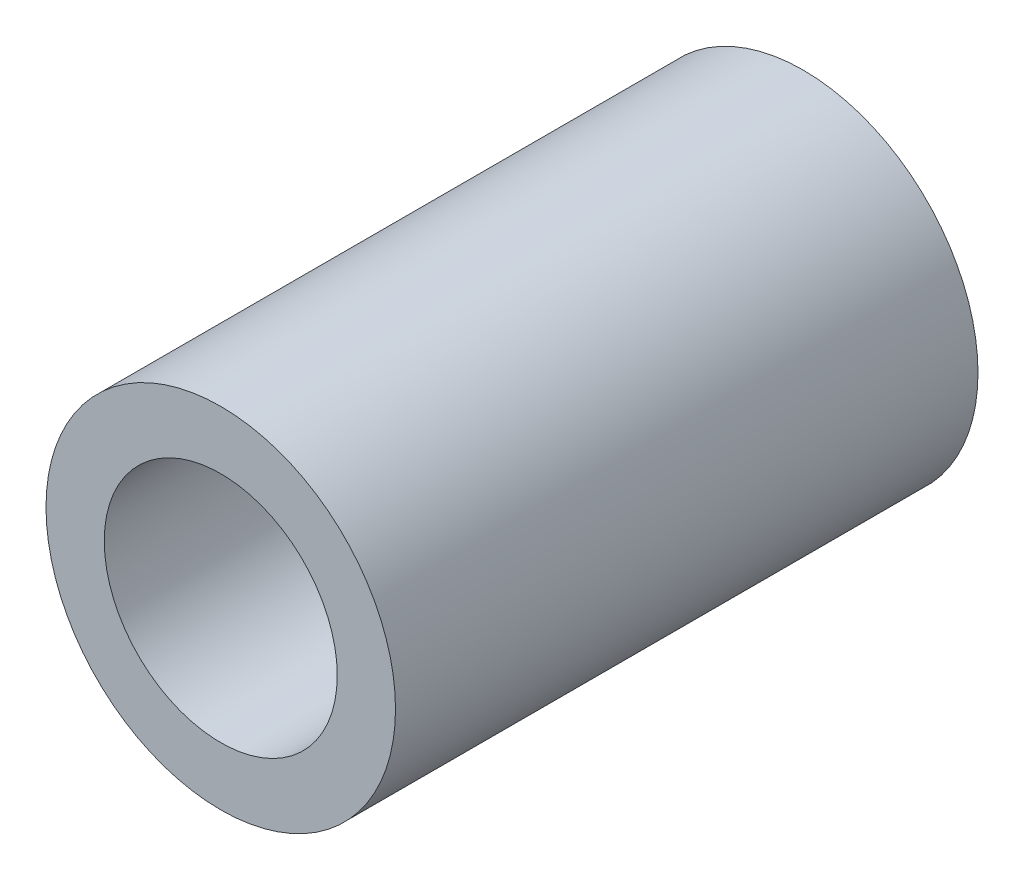
ISO-10303-21;
HEADER;
FILE_DESCRIPTION(('STEP AP214'),'2;1');
FILE_NAME('part.step','',(''),(''),'','','');
FILE_SCHEMA(('AUTOMOTIVE_DESIGN { 1 0 10303 214 1 1 1 1 }'));
ENDSEC;
DATA;
#1=APPLICATION_CONTEXT('core data for automotive mechanical design processes');
#2=APPLICATION_PROTOCOL_DEFINITION('international standard','automotive_design',2000,#1);
#3=PRODUCT_CONTEXT('',#1,'mechanical');
#4=PRODUCT('Part','Part','',(#3));
#5=PRODUCT_RELATED_PRODUCT_CATEGORY('part','',(#4));
#6=PRODUCT_DEFINITION_FORMATION('','',#4);
#7=PRODUCT_DEFINITION_CONTEXT('part definition',#1,'design');
#8=PRODUCT_DEFINITION('design','',#6,#7);
#9=PRODUCT_DEFINITION_SHAPE('','',#8);
#10=(LENGTH_UNIT() NAMED_UNIT(*) SI_UNIT(.MILLI.,.METRE.));
#11=(NAMED_UNIT(*) PLANE_ANGLE_UNIT() SI_UNIT($,.RADIAN.));
#12=(NAMED_UNIT(*) SI_UNIT($,.STERADIAN.) SOLID_ANGLE_UNIT());
#13=UNCERTAINTY_MEASURE_WITH_UNIT(LENGTH_MEASURE(1.E-05),#10,'distance_accuracy_value','');
#14=(GEOMETRIC_REPRESENTATION_CONTEXT(3) GLOBAL_UNCERTAINTY_ASSIGNED_CONTEXT((#13)) GLOBAL_UNIT_ASSIGNED_CONTEXT((#10,
#11,#12)) REPRESENTATION_CONTEXT('',''));
#15=CARTESIAN_POINT('',(0.,0.,0.));
#16=DIRECTION('',(0.,0.,1.));
#17=DIRECTION('',(1.,0.,0.));
#18=AXIS2_PLACEMENT_3D('',#15,#16,#17);
#19=CARTESIAN_POINT('',(0.,0.,12.7));
#20=DIRECTION('',(0.,0.,1.));
#21=DIRECTION('',(1.,0.,0.));
#22=AXIS2_PLACEMENT_3D('',#19,#20,#21);
#23=PLANE('',#22);
#24=CARTESIAN_POINT('',(0.,0.,12.7));
#25=DIRECTION('',(0.,0.,1.));
#26=DIRECTION('',(1.,0.,0.));
#27=AXIS2_PLACEMENT_3D('',#24,#25,#26);
#28=CIRCLE('',#27,3.81);
#29=CARTESIAN_POINT('',(3.81,0.,12.7));
#30=VERTEX_POINT('',#29);
#31=EDGE_CURVE('E52',#30,#30,#28,.T.);
#32=ORIENTED_EDGE('',*,*,#31,.T.);
#33=EDGE_LOOP('',(#32));
#34=FACE_BOUND('',#33,.T.);
#35=CARTESIAN_POINT('',(0.,0.,12.7));
#36=DIRECTION('',(0.,0.,1.));
#37=DIRECTION('',(1.,0.,0.));
#38=AXIS2_PLACEMENT_3D('',#35,#36,#37);
#39=CIRCLE('',#38,2.54);
#40=CARTESIAN_POINT('',(2.54,0.,12.7));
#41=VERTEX_POINT('',#40);
#42=EDGE_CURVE('E61',#41,#41,#39,.T.);
#43=ORIENTED_EDGE('',*,*,#42,.F.);
#44=EDGE_LOOP('',(#43));
#45=FACE_BOUND('',#44,.T.);
#46=ADVANCED_FACE('F44',(#34,#45),#23,.T.);
#47=CARTESIAN_POINT('',(0.,0.,0.));
#48=DIRECTION('',(0.,0.,1.));
#49=DIRECTION('',(1.,0.,0.));
#50=AXIS2_PLACEMENT_3D('',#47,#48,#49);
#51=PLANE('',#50);
#52=CARTESIAN_POINT('',(0.,0.,0.));
#53=DIRECTION('',(0.,0.,1.));
#54=DIRECTION('',(1.,0.,0.));
#55=AXIS2_PLACEMENT_3D('',#52,#53,#54);
#56=CIRCLE('',#55,3.81);
#57=CARTESIAN_POINT('',(3.81,0.,0.));
#58=VERTEX_POINT('',#57);
#59=EDGE_CURVE('E59',#58,#58,#56,.T.);
#60=ORIENTED_EDGE('',*,*,#59,.F.);
#61=EDGE_LOOP('',(#60));
#62=FACE_BOUND('',#61,.T.);
#63=ADVANCED_FACE('F71',(#62),#51,.F.);
#64=CARTESIAN_POINT('',(0.,0.,12.7));
#65=DIRECTION('',(0.,0.,-1.));
#66=DIRECTION('',(-1.,0.,0.));
#67=AXIS2_PLACEMENT_3D('',#64,#65,#66);
#68=CYLINDRICAL_SURFACE('',#67,3.81);
#69=ORIENTED_EDGE('',*,*,#31,.F.);
#70=EDGE_LOOP('',(#69));
#71=FACE_BOUND('',#70,.T.);
#72=ORIENTED_EDGE('',*,*,#59,.T.);
#73=EDGE_LOOP('',(#72));
#74=FACE_BOUND('',#73,.T.);
#75=ADVANCED_FACE('F50',(#71,#74),#68,.T.);
#76=CARTESIAN_POINT('',(0.,0.,12.7));
#77=DIRECTION('',(0.,0.,-1.));
#78=DIRECTION('',(-1.,0.,0.));
#79=AXIS2_PLACEMENT_3D('',#76,#77,#78);
#80=CYLINDRICAL_SURFACE('',#79,2.54);
#81=CARTESIAN_POINT('',(0.,0.,2.54));
#82=DIRECTION('',(0.,0.,1.));
#83=DIRECTION('',(1.,0.,0.));
#84=AXIS2_PLACEMENT_3D('',#81,#82,#83);
#85=CIRCLE('',#84,2.54);
#86=CARTESIAN_POINT('',(2.54,0.,2.54));
#87=VERTEX_POINT('',#86);
#88=EDGE_CURVE('E10',#87,#87,#85,.T.);
#89=ORIENTED_EDGE('',*,*,#88,.F.);
#90=EDGE_LOOP('',(#89));
#91=FACE_BOUND('',#90,.T.);
#92=ORIENTED_EDGE('',*,*,#42,.T.);
#93=EDGE_LOOP('',(#92));
#94=FACE_BOUND('',#93,.T.);
#95=ADVANCED_FACE('F69',(#91,#94),#80,.F.);
#96=CARTESIAN_POINT('',(0.,0.,2.54));
#97=DIRECTION('',(0.,0.,1.));
#98=DIRECTION('',(1.,0.,0.));
#99=AXIS2_PLACEMENT_3D('',#96,#97,#98);
#100=PLANE('',#99);
#101=ORIENTED_EDGE('',*,*,#88,.T.);
#102=EDGE_LOOP('',(#101));
#103=FACE_BOUND('',#102,.T.);
#104=ADVANCED_FACE('F84',(#103),#100,.T.);
#105=CLOSED_SHELL('',(#46,#63,#75,#95,#104));
#106=MANIFOLD_SOLID_BREP('B2',#105);
#107=ADVANCED_BREP_SHAPE_REPRESENTATION('',(#18,#106),#14);
#108=SHAPE_DEFINITION_REPRESENTATION(#9,#107);
ENDSEC;
END-ISO-10303-21;
